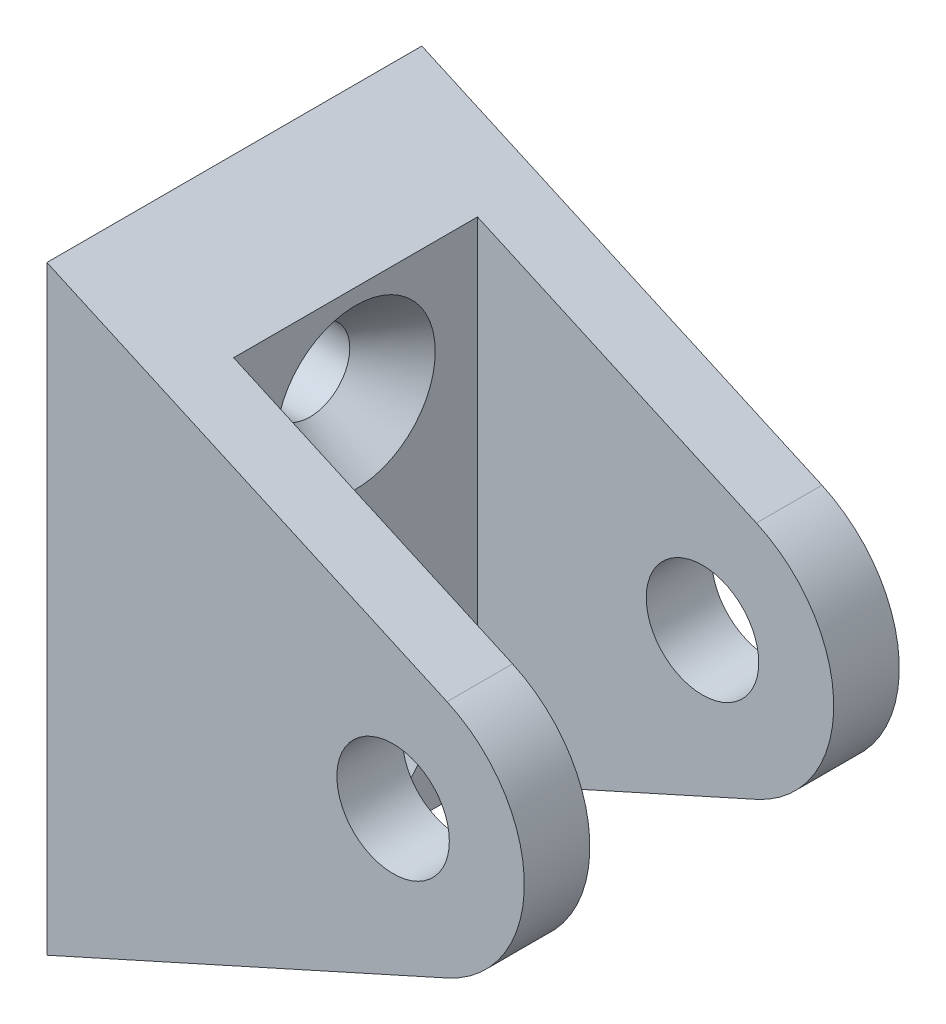
ISO-10303-21;
HEADER;
FILE_DESCRIPTION(('STEP AP214'),'2;1');
FILE_NAME('part.step','',(''),(''),'','','');
FILE_SCHEMA(('AUTOMOTIVE_DESIGN { 1 0 10303 214 1 1 1 1 }'));
ENDSEC;
DATA;
#1=APPLICATION_CONTEXT('core data for automotive mechanical design processes');
#2=APPLICATION_PROTOCOL_DEFINITION('international standard','automotive_design',2000,#1);
#3=PRODUCT_CONTEXT('',#1,'mechanical');
#4=PRODUCT('Part','Part','',(#3));
#5=PRODUCT_RELATED_PRODUCT_CATEGORY('part','',(#4));
#6=PRODUCT_DEFINITION_FORMATION('','',#4);
#7=PRODUCT_DEFINITION_CONTEXT('part definition',#1,'design');
#8=PRODUCT_DEFINITION('design','',#6,#7);
#9=PRODUCT_DEFINITION_SHAPE('','',#8);
#10=(LENGTH_UNIT() NAMED_UNIT(*) SI_UNIT(.MILLI.,.METRE.));
#11=(NAMED_UNIT(*) PLANE_ANGLE_UNIT() SI_UNIT($,.RADIAN.));
#12=(NAMED_UNIT(*) SI_UNIT($,.STERADIAN.) SOLID_ANGLE_UNIT());
#13=UNCERTAINTY_MEASURE_WITH_UNIT(LENGTH_MEASURE(1.E-05),#10,'distance_accuracy_value','');
#14=(GEOMETRIC_REPRESENTATION_CONTEXT(3) GLOBAL_UNCERTAINTY_ASSIGNED_CONTEXT((#13)) GLOBAL_UNIT_ASSIGNED_CONTEXT((#10,
#11,#12)) REPRESENTATION_CONTEXT('',''));
#15=CARTESIAN_POINT('',(0.,0.,0.));
#16=DIRECTION('',(0.,0.,1.));
#17=DIRECTION('',(1.,0.,0.));
#18=AXIS2_PLACEMENT_3D('',#15,#16,#17);
#19=CARTESIAN_POINT('',(0.,50.8,-31.75));
#20=DIRECTION('',(1.,0.,0.));
#21=DIRECTION('',(0.,0.,-1.));
#22=AXIS2_PLACEMENT_3D('',#19,#20,#21);
#23=PLANE('',#22);
#24=CARTESIAN_POINT('',(0.,38.1,-15.875));
#25=DIRECTION('',(1.,0.,0.));
#26=DIRECTION('',(0.,0.,-1.));
#27=AXIS2_PLACEMENT_3D('',#24,#25,#26);
#28=CIRCLE('',#27,3.3782);
#29=CARTESIAN_POINT('',(0.,38.1,-19.2532));
#30=VERTEX_POINT('',#29);
#31=EDGE_CURVE('E191',#30,#30,#28,.T.);
#32=ORIENTED_EDGE('',*,*,#31,.T.);
#33=EDGE_LOOP('',(#32));
#34=FACE_BOUND('',#33,.T.);
#35=CARTESIAN_POINT('',(0.,12.7,-15.875));
#36=DIRECTION('',(1.,0.,0.));
#37=DIRECTION('',(0.,0.,-1.));
#38=AXIS2_PLACEMENT_3D('',#35,#36,#37);
#39=CIRCLE('',#38,3.37819999999999);
#40=CARTESIAN_POINT('',(0.,12.7,-19.2532));
#41=VERTEX_POINT('',#40);
#42=EDGE_CURVE('E118',#41,#41,#39,.T.);
#43=ORIENTED_EDGE('',*,*,#42,.T.);
#44=EDGE_LOOP('',(#43));
#45=FACE_BOUND('',#44,.T.);
#46=DIRECTION('',(0.,0.,1.));
#47=VECTOR('',#46,1.);
#48=CARTESIAN_POINT('',(0.,0.,-31.75));
#49=LINE('',#48,#47);
#50=CARTESIAN_POINT('',(0.,0.,-31.75));
#51=VERTEX_POINT('',#50);
#52=CARTESIAN_POINT('',(0.,0.,0.));
#53=VERTEX_POINT('',#52);
#54=EDGE_CURVE('E107',#51,#53,#49,.T.);
#55=ORIENTED_EDGE('',*,*,#54,.T.);
#56=DIRECTION('',(0.,-1.,0.));
#57=VECTOR('',#56,1.);
#58=CARTESIAN_POINT('',(0.,50.8,0.));
#59=LINE('',#58,#57);
#60=CARTESIAN_POINT('',(0.,50.8,0.));
#61=VERTEX_POINT('',#60);
#62=EDGE_CURVE('E11',#61,#53,#59,.T.);
#63=ORIENTED_EDGE('',*,*,#62,.F.);
#64=DIRECTION('',(0.,0.,1.));
#65=VECTOR('',#64,1.);
#66=CARTESIAN_POINT('',(0.,50.8,-31.75));
#67=LINE('',#66,#65);
#68=CARTESIAN_POINT('',(0.,50.8,-31.75));
#69=VERTEX_POINT('',#68);
#70=EDGE_CURVE('E117',#69,#61,#67,.T.);
#71=ORIENTED_EDGE('',*,*,#70,.F.);
#72=DIRECTION('',(0.,-1.,0.));
#73=VECTOR('',#72,1.);
#74=CARTESIAN_POINT('',(0.,50.8,-31.75));
#75=LINE('',#74,#73);
#76=EDGE_CURVE('E125',#69,#51,#75,.T.);
#77=ORIENTED_EDGE('',*,*,#76,.T.);
#78=EDGE_LOOP('',(#55,#63,#71,#77));
#79=FACE_BOUND('',#78,.T.);
#80=ADVANCED_FACE('F45',(#34,#45,#79),#23,.F.);
#81=CARTESIAN_POINT('',(0.,50.8,0.));
#82=DIRECTION('',(0.,0.,-1.));
#83=DIRECTION('',(-1.,0.,0.));
#84=AXIS2_PLACEMENT_3D('',#81,#82,#83);
#85=PLANE('',#84);
#86=CARTESIAN_POINT('',(29.3156655712476,25.4,0.));
#87=DIRECTION('',(0.,0.,1.));
#88=DIRECTION('',(1.,0.,0.));
#89=AXIS2_PLACEMENT_3D('',#86,#87,#88);
#90=CIRCLE('',#89,4.7625);
#91=CARTESIAN_POINT('',(34.0781655712476,25.4,0.));
#92=VERTEX_POINT('',#91);
#93=EDGE_CURVE('E272',#92,#92,#90,.T.);
#94=ORIENTED_EDGE('',*,*,#93,.F.);
#95=EDGE_LOOP('',(#94));
#96=FACE_BOUND('',#95,.T.);
#97=ORIENTED_EDGE('',*,*,#62,.T.);
#98=DIRECTION('',(-0.91169837932912,-0.410860152763268,0.));
#99=VECTOR('',#98,1.);
#100=CARTESIAN_POINT('',(0.,0.,0.));
#101=LINE('',#100,#99);
#102=CARTESIAN_POINT('',(33.8813490188294,15.2687517597052,0.));
#103=VERTEX_POINT('',#102);
#104=EDGE_CURVE('E68',#103,#53,#101,.T.);
#105=ORIENTED_EDGE('',*,*,#104,.F.);
#106=CARTESIAN_POINT('',(29.3156655712476,25.4,0.));
#107=DIRECTION('',(0.,0.,-1.));
#108=DIRECTION('',(1.,0.,0.));
#109=AXIS2_PLACEMENT_3D('',#106,#107,#108);
#110=CIRCLE('',#109,11.1125);
#111=CARTESIAN_POINT('',(33.8813490188294,35.5312482402949,0.));
#112=VERTEX_POINT('',#111);
#113=EDGE_CURVE('E290',#112,#103,#110,.T.);
#114=ORIENTED_EDGE('',*,*,#113,.F.);
#115=DIRECTION('',(0.91169837932912,-0.410860152763267,0.));
#116=VECTOR('',#115,1.);
#117=CARTESIAN_POINT('',(0.,50.8,0.));
#118=LINE('',#117,#116);
#119=EDGE_CURVE('E278',#61,#112,#118,.T.);
#120=ORIENTED_EDGE('',*,*,#119,.F.);
#121=EDGE_LOOP('',(#97,#105,#114,#120));
#122=FACE_BOUND('',#121,.T.);
#123=ADVANCED_FACE('F231',(#96,#122),#85,.F.);
#124=CARTESIAN_POINT('',(42.0156655712476,50.8,-5.5499));
#125=DIRECTION('',(0.,0.,1.));
#126=DIRECTION('',(1.,0.,0.));
#127=AXIS2_PLACEMENT_3D('',#124,#125,#126);
#128=PLANE('',#127);
#129=CARTESIAN_POINT('',(29.3156655712476,25.4,-5.5499));
#130=DIRECTION('',(0.,0.,1.));
#131=DIRECTION('',(1.,0.,0.));
#132=AXIS2_PLACEMENT_3D('',#129,#130,#131);
#133=CIRCLE('',#132,4.7625);
#134=CARTESIAN_POINT('',(34.0781655712476,25.4,-5.5499));
#135=VERTEX_POINT('',#134);
#136=EDGE_CURVE('E173',#135,#135,#133,.T.);
#137=ORIENTED_EDGE('',*,*,#136,.T.);
#138=EDGE_LOOP('',(#137));
#139=FACE_BOUND('',#138,.T.);
#140=CARTESIAN_POINT('',(29.3156655712476,25.4,-5.5499));
#141=DIRECTION('',(0.,0.,1.));
#142=DIRECTION('',(1.,0.,0.));
#143=AXIS2_PLACEMENT_3D('',#140,#141,#142);
#144=CIRCLE('',#143,11.1125);
#145=CARTESIAN_POINT('',(33.8813490188294,35.5312482402949,-5.5499));
#146=VERTEX_POINT('',#145);
#147=CARTESIAN_POINT('',(33.8813490188294,15.2687517597052,-5.5499));
#148=VERTEX_POINT('',#147);
#149=EDGE_CURVE('E153',#146,#148,#144,.F.);
#150=ORIENTED_EDGE('',*,*,#149,.T.);
#151=DIRECTION('',(-0.91169837932912,-0.410860152763268,0.));
#152=VECTOR('',#151,1.);
#153=CARTESIAN_POINT('',(53.9518575909872,24.3135986136189,-5.5499));
#154=LINE('',#153,#152);
#155=CARTESIAN_POINT('',(10.2656655712476,4.62625910108896,-5.5499));
#156=VERTEX_POINT('',#155);
#157=EDGE_CURVE('E152',#148,#156,#154,.T.);
#158=ORIENTED_EDGE('',*,*,#157,.T.);
#159=DIRECTION('',(0.,-1.,0.));
#160=VECTOR('',#159,1.);
#161=CARTESIAN_POINT('',(10.2656655712476,50.8,-5.5499));
#162=LINE('',#161,#160);
#163=CARTESIAN_POINT('',(10.2656655712476,46.173740898911,-5.5499));
#164=VERTEX_POINT('',#163);
#165=EDGE_CURVE('E53',#164,#156,#162,.T.);
#166=ORIENTED_EDGE('',*,*,#165,.F.);
#167=DIRECTION('',(0.91169837932912,-0.410860152763267,0.));
#168=VECTOR('',#167,1.);
#169=CARTESIAN_POINT('',(34.9231663924038,35.0617494949168,-5.5499));
#170=LINE('',#169,#168);
#171=EDGE_CURVE('E151',#164,#146,#170,.T.);
#172=ORIENTED_EDGE('',*,*,#171,.T.);
#173=EDGE_LOOP('',(#150,#158,#166,#172));
#174=FACE_BOUND('',#173,.T.);
#175=ADVANCED_FACE('F150',(#139,#174),#128,.F.);
#176=CARTESIAN_POINT('',(10.2656655712476,50.8,-5.5499));
#177=DIRECTION('',(-1.,0.,0.));
#178=DIRECTION('',(0.,0.,1.));
#179=AXIS2_PLACEMENT_3D('',#176,#177,#178);
#180=PLANE('',#179);
#181=CARTESIAN_POINT('',(10.2656655712476,38.1,-15.875));
#182=DIRECTION('',(1.,0.,0.));
#183=DIRECTION('',(0.,0.,-1.));
#184=AXIS2_PLACEMENT_3D('',#181,#182,#183);
#185=CIRCLE('',#184,6.7437);
#186=CARTESIAN_POINT('',(10.2656655712476,38.1,-22.6187));
#187=VERTEX_POINT('',#186);
#188=EDGE_CURVE('E183',#187,#187,#185,.T.);
#189=ORIENTED_EDGE('',*,*,#188,.F.);
#190=EDGE_LOOP('',(#189));
#191=FACE_BOUND('',#190,.T.);
#192=CARTESIAN_POINT('',(10.2656655712476,12.7,-15.875));
#193=DIRECTION('',(1.,0.,0.));
#194=DIRECTION('',(0.,0.,-1.));
#195=AXIS2_PLACEMENT_3D('',#192,#193,#194);
#196=CIRCLE('',#195,6.7437);
#197=CARTESIAN_POINT('',(10.2656655712476,12.7,-22.6187));
#198=VERTEX_POINT('',#197);
#199=EDGE_CURVE('E195',#198,#198,#196,.T.);
#200=ORIENTED_EDGE('',*,*,#199,.F.);
#201=EDGE_LOOP('',(#200));
#202=FACE_BOUND('',#201,.T.);
#203=ORIENTED_EDGE('',*,*,#165,.T.);
#204=DIRECTION('',(0.,0.,-1.));
#205=VECTOR('',#204,1.);
#206=CARTESIAN_POINT('',(10.2656655712476,4.62625910108896,-5.5499));
#207=LINE('',#206,#205);
#208=CARTESIAN_POINT('',(10.2656655712476,4.62625910108896,-26.2001));
#209=VERTEX_POINT('',#208);
#210=EDGE_CURVE('E145',#156,#209,#207,.T.);
#211=ORIENTED_EDGE('',*,*,#210,.T.);
#212=DIRECTION('',(0.,-1.,0.));
#213=VECTOR('',#212,1.);
#214=CARTESIAN_POINT('',(10.2656655712476,50.8,-26.2001));
#215=LINE('',#214,#213);
#216=CARTESIAN_POINT('',(10.2656655712476,46.173740898911,-26.2001));
#217=VERTEX_POINT('',#216);
#218=EDGE_CURVE('E131',#217,#209,#215,.T.);
#219=ORIENTED_EDGE('',*,*,#218,.F.);
#220=DIRECTION('',(0.,0.,1.));
#221=VECTOR('',#220,1.);
#222=CARTESIAN_POINT('',(10.2656655712476,46.173740898911,-5.5499));
#223=LINE('',#222,#221);
#224=EDGE_CURVE('E60',#217,#164,#223,.T.);
#225=ORIENTED_EDGE('',*,*,#224,.T.);
#226=EDGE_LOOP('',(#203,#211,#219,#225));
#227=FACE_BOUND('',#226,.T.);
#228=ADVANCED_FACE('F143',(#191,#202,#227),#180,.F.);
#229=CARTESIAN_POINT('',(10.2656655712476,50.8,-26.2001));
#230=DIRECTION('',(0.,0.,-1.));
#231=DIRECTION('',(-1.,0.,0.));
#232=AXIS2_PLACEMENT_3D('',#229,#230,#231);
#233=PLANE('',#232);
#234=CARTESIAN_POINT('',(29.3156655712476,25.4,-26.2001));
#235=DIRECTION('',(0.,0.,-1.));
#236=DIRECTION('',(-1.,0.,0.));
#237=AXIS2_PLACEMENT_3D('',#234,#235,#236);
#238=CIRCLE('',#237,4.7625);
#239=CARTESIAN_POINT('',(24.5531655712476,25.4,-26.2001));
#240=VERTEX_POINT('',#239);
#241=EDGE_CURVE('E169',#240,#240,#238,.T.);
#242=ORIENTED_EDGE('',*,*,#241,.T.);
#243=EDGE_LOOP('',(#242));
#244=FACE_BOUND('',#243,.T.);
#245=ORIENTED_EDGE('',*,*,#218,.T.);
#246=DIRECTION('',(0.91169837932912,0.410860152763268,0.));
#247=VECTOR('',#246,1.);
#248=CARTESIAN_POINT('',(27.561450158822,12.4206666145042,-26.2001));
#249=LINE('',#248,#247);
#250=CARTESIAN_POINT('',(33.8813490188294,15.2687517597052,-26.2001));
#251=VERTEX_POINT('',#250);
#252=EDGE_CURVE('E161',#209,#251,#249,.T.);
#253=ORIENTED_EDGE('',*,*,#252,.T.);
#254=CARTESIAN_POINT('',(29.3156655712476,25.4,-26.2001));
#255=DIRECTION('',(0.,0.,-1.));
#256=DIRECTION('',(-1.,0.,0.));
#257=AXIS2_PLACEMENT_3D('',#254,#255,#256);
#258=CIRCLE('',#257,11.1125);
#259=CARTESIAN_POINT('',(33.8813490188294,35.5312482402949,-26.2001));
#260=VERTEX_POINT('',#259);
#261=EDGE_CURVE('E177',#251,#260,#258,.F.);
#262=ORIENTED_EDGE('',*,*,#261,.T.);
#263=DIRECTION('',(-0.91169837932912,0.410860152763267,0.));
#264=VECTOR('',#263,1.);
#265=CARTESIAN_POINT('',(8.53275896023857,46.9546814940315,-26.2001));
#266=LINE('',#265,#264);
#267=EDGE_CURVE('E156',#260,#217,#266,.T.);
#268=ORIENTED_EDGE('',*,*,#267,.T.);
#269=EDGE_LOOP('',(#245,#253,#262,#268));
#270=FACE_BOUND('',#269,.T.);
#271=ADVANCED_FACE('F222',(#244,#270),#233,.F.);
#272=CARTESIAN_POINT('',(42.0156655712476,50.8,-31.75));
#273=DIRECTION('',(0.,0.,1.));
#274=DIRECTION('',(1.,0.,0.));
#275=AXIS2_PLACEMENT_3D('',#272,#273,#274);
#276=PLANE('',#275);
#277=CARTESIAN_POINT('',(29.3156655712476,25.4,-31.75));
#278=DIRECTION('',(0.,0.,1.));
#279=DIRECTION('',(1.,0.,0.));
#280=AXIS2_PLACEMENT_3D('',#277,#278,#279);
#281=CIRCLE('',#280,4.7625);
#282=CARTESIAN_POINT('',(34.0781655712476,25.4,-31.75));
#283=VERTEX_POINT('',#282);
#284=EDGE_CURVE('E269',#283,#283,#281,.F.);
#285=ORIENTED_EDGE('',*,*,#284,.F.);
#286=EDGE_LOOP('',(#285));
#287=FACE_BOUND('',#286,.T.);
#288=CARTESIAN_POINT('',(29.3156655712476,25.4,-31.75));
#289=DIRECTION('',(0.,0.,1.));
#290=DIRECTION('',(1.,0.,0.));
#291=AXIS2_PLACEMENT_3D('',#288,#289,#290);
#292=CIRCLE('',#291,11.1125);
#293=CARTESIAN_POINT('',(33.8813490188294,15.2687517597052,-31.75));
#294=VERTEX_POINT('',#293);
#295=CARTESIAN_POINT('',(33.8813490188294,35.5312482402949,-31.75));
#296=VERTEX_POINT('',#295);
#297=EDGE_CURVE('E127',#294,#296,#292,.T.);
#298=ORIENTED_EDGE('',*,*,#297,.F.);
#299=DIRECTION('',(0.91169837932912,0.410860152763268,0.));
#300=VECTOR('',#299,1.);
#301=CARTESIAN_POINT('',(0.,0.,-31.75));
#302=LINE('',#301,#300);
#303=EDGE_CURVE('E111',#51,#294,#302,.T.);
#304=ORIENTED_EDGE('',*,*,#303,.F.);
#305=ORIENTED_EDGE('',*,*,#76,.F.);
#306=DIRECTION('',(-0.91169837932912,0.410860152763267,0.));
#307=VECTOR('',#306,1.);
#308=CARTESIAN_POINT('',(0.,50.8,-31.75));
#309=LINE('',#308,#307);
#310=EDGE_CURVE('E281',#296,#69,#309,.T.);
#311=ORIENTED_EDGE('',*,*,#310,.F.);
#312=EDGE_LOOP('',(#298,#304,#305,#311));
#313=FACE_BOUND('',#312,.T.);
#314=ADVANCED_FACE('F123',(#287,#313),#276,.F.);
#315=CARTESIAN_POINT('',(10.2656655712476,12.7,-15.875));
#316=DIRECTION('',(1.,0.,0.));
#317=DIRECTION('',(0.,0.,-1.));
#318=AXIS2_PLACEMENT_3D('',#315,#316,#317);
#319=CYLINDRICAL_SURFACE('',#318,3.37819999999999);
#320=ORIENTED_EDGE('',*,*,#42,.F.);
#321=EDGE_LOOP('',(#320));
#322=FACE_BOUND('',#321,.T.);
#323=CARTESIAN_POINT('',(6.39410069674526,12.7,-15.875));
#324=DIRECTION('',(1.,0.,0.));
#325=DIRECTION('',(0.,0.,-1.));
#326=AXIS2_PLACEMENT_3D('',#323,#324,#325);
#327=CIRCLE('',#326,3.37819999999999);
#328=CARTESIAN_POINT('',(6.39410069674526,12.7,-19.2532));
#329=VERTEX_POINT('',#328);
#330=EDGE_CURVE('E199',#329,#329,#327,.T.);
#331=ORIENTED_EDGE('',*,*,#330,.T.);
#332=EDGE_LOOP('',(#331));
#333=FACE_BOUND('',#332,.T.);
#334=ADVANCED_FACE('F208',(#322,#333),#319,.F.);
#335=CARTESIAN_POINT('',(10.2656655712476,12.7,-15.875));
#336=DIRECTION('',(1.,0.,0.));
#337=DIRECTION('',(0.,0.,-1.));
#338=AXIS2_PLACEMENT_3D('',#335,#336,#337);
#339=CONICAL_SURFACE('',#338,6.7437,0.715584993317674);
#340=ORIENTED_EDGE('',*,*,#330,.F.);
#341=EDGE_LOOP('',(#340));
#342=FACE_BOUND('',#341,.T.);
#343=ORIENTED_EDGE('',*,*,#199,.T.);
#344=EDGE_LOOP('',(#343));
#345=FACE_BOUND('',#344,.T.);
#346=ADVANCED_FACE('F211',(#342,#345),#339,.F.);
#347=CARTESIAN_POINT('',(10.2656655712476,38.1,-15.875));
#348=DIRECTION('',(1.,0.,0.));
#349=DIRECTION('',(0.,0.,-1.));
#350=AXIS2_PLACEMENT_3D('',#347,#348,#349);
#351=CYLINDRICAL_SURFACE('',#350,3.37819999999999);
#352=ORIENTED_EDGE('',*,*,#31,.F.);
#353=EDGE_LOOP('',(#352));
#354=FACE_BOUND('',#353,.T.);
#355=CARTESIAN_POINT('',(6.39410069674526,38.1,-15.875));
#356=DIRECTION('',(1.,0.,0.));
#357=DIRECTION('',(0.,0.,-1.));
#358=AXIS2_PLACEMENT_3D('',#355,#356,#357);
#359=CIRCLE('',#358,3.37819999999998);
#360=CARTESIAN_POINT('',(6.39410069674526,38.1,-19.2532));
#361=VERTEX_POINT('',#360);
#362=EDGE_CURVE('E187',#361,#361,#359,.T.);
#363=ORIENTED_EDGE('',*,*,#362,.T.);
#364=EDGE_LOOP('',(#363));
#365=FACE_BOUND('',#364,.T.);
#366=ADVANCED_FACE('F217',(#354,#365),#351,.F.);
#367=CARTESIAN_POINT('',(10.2656655712476,38.1,-15.875));
#368=DIRECTION('',(1.,0.,0.));
#369=DIRECTION('',(0.,0.,-1.));
#370=AXIS2_PLACEMENT_3D('',#367,#368,#369);
#371=CONICAL_SURFACE('',#370,6.7437,0.715584993317675);
#372=ORIENTED_EDGE('',*,*,#362,.F.);
#373=EDGE_LOOP('',(#372));
#374=FACE_BOUND('',#373,.T.);
#375=ORIENTED_EDGE('',*,*,#188,.T.);
#376=EDGE_LOOP('',(#375));
#377=FACE_BOUND('',#376,.T.);
#378=ADVANCED_FACE('F246',(#374,#377),#371,.F.);
#379=CARTESIAN_POINT('',(29.3156655712476,25.4,-97.6738663413708));
#380=DIRECTION('',(0.,0.,1.));
#381=DIRECTION('',(1.,0.,0.));
#382=AXIS2_PLACEMENT_3D('',#379,#380,#381);
#383=CYLINDRICAL_SURFACE('',#382,11.1125);
#384=DIRECTION('',(0.,0.,1.));
#385=VECTOR('',#384,1.);
#386=CARTESIAN_POINT('',(33.8813490188294,35.5312482402949,-97.6738663413708));
#387=LINE('',#386,#385);
#388=EDGE_CURVE('E300',#146,#112,#387,.T.);
#389=ORIENTED_EDGE('',*,*,#388,.T.);
#390=ORIENTED_EDGE('',*,*,#113,.T.);
#391=DIRECTION('',(0.,0.,1.));
#392=VECTOR('',#391,1.);
#393=CARTESIAN_POINT('',(33.8813490188294,15.2687517597052,-97.6738663413708));
#394=LINE('',#393,#392);
#395=EDGE_CURVE('E284',#148,#103,#394,.T.);
#396=ORIENTED_EDGE('',*,*,#395,.F.);
#397=ORIENTED_EDGE('',*,*,#149,.F.);
#398=EDGE_LOOP('',(#389,#390,#396,#397));
#399=FACE_BOUND('',#398,.T.);
#400=ADVANCED_FACE('F251',(#399),#383,.T.);
#401=EDGE_CURVE('E297',#294,#251,#394,.T.);
#402=ORIENTED_EDGE('',*,*,#401,.F.);
#403=ORIENTED_EDGE('',*,*,#297,.T.);
#404=EDGE_CURVE('E296',#296,#260,#387,.T.);
#405=ORIENTED_EDGE('',*,*,#404,.T.);
#406=ORIENTED_EDGE('',*,*,#261,.F.);
#407=EDGE_LOOP('',(#402,#403,#405,#406));
#408=FACE_BOUND('',#407,.T.);
#409=ADVANCED_FACE('F256',(#408),#383,.T.);
#410=CARTESIAN_POINT('',(0.,50.8,-97.6738663413708));
#411=DIRECTION('',(-0.410860152763267,-0.91169837932912,0.));
#412=DIRECTION('',(0.91169837932912,-0.410860152763267,0.));
#413=AXIS2_PLACEMENT_3D('',#410,#411,#412);
#414=PLANE('',#413);
#415=ORIENTED_EDGE('',*,*,#224,.F.);
#416=ORIENTED_EDGE('',*,*,#267,.F.);
#417=ORIENTED_EDGE('',*,*,#404,.F.);
#418=ORIENTED_EDGE('',*,*,#310,.T.);
#419=ORIENTED_EDGE('',*,*,#70,.T.);
#420=ORIENTED_EDGE('',*,*,#119,.T.);
#421=ORIENTED_EDGE('',*,*,#388,.F.);
#422=ORIENTED_EDGE('',*,*,#171,.F.);
#423=EDGE_LOOP('',(#415,#416,#417,#418,#419,#420,#421,#422));
#424=FACE_BOUND('',#423,.T.);
#425=ADVANCED_FACE('F309',(#424),#414,.F.);
#426=CARTESIAN_POINT('',(0.,0.,-97.6738663413708));
#427=DIRECTION('',(-0.410860152763268,0.91169837932912,0.));
#428=DIRECTION('',(-0.91169837932912,-0.410860152763268,0.));
#429=AXIS2_PLACEMENT_3D('',#426,#427,#428);
#430=PLANE('',#429);
#431=ORIENTED_EDGE('',*,*,#395,.T.);
#432=ORIENTED_EDGE('',*,*,#104,.T.);
#433=ORIENTED_EDGE('',*,*,#54,.F.);
#434=ORIENTED_EDGE('',*,*,#303,.T.);
#435=ORIENTED_EDGE('',*,*,#401,.T.);
#436=ORIENTED_EDGE('',*,*,#252,.F.);
#437=ORIENTED_EDGE('',*,*,#210,.F.);
#438=ORIENTED_EDGE('',*,*,#157,.F.);
#439=EDGE_LOOP('',(#431,#432,#433,#434,#435,#436,#437,#438));
#440=FACE_BOUND('',#439,.T.);
#441=ADVANCED_FACE('F109',(#440),#430,.F.);
#442=CARTESIAN_POINT('',(29.3156655712476,25.4,-97.6738663413708));
#443=DIRECTION('',(0.,0.,1.));
#444=DIRECTION('',(1.,0.,0.));
#445=AXIS2_PLACEMENT_3D('',#442,#443,#444);
#446=CYLINDRICAL_SURFACE('',#445,4.7625);
#447=ORIENTED_EDGE('',*,*,#284,.T.);
#448=EDGE_LOOP('',(#447));
#449=FACE_BOUND('',#448,.T.);
#450=ORIENTED_EDGE('',*,*,#241,.F.);
#451=EDGE_LOOP('',(#450));
#452=FACE_BOUND('',#451,.T.);
#453=ADVANCED_FACE('F318',(#449,#452),#446,.F.);
#454=ORIENTED_EDGE('',*,*,#93,.T.);
#455=EDGE_LOOP('',(#454));
#456=FACE_BOUND('',#455,.T.);
#457=ORIENTED_EDGE('',*,*,#136,.F.);
#458=EDGE_LOOP('',(#457));
#459=FACE_BOUND('',#458,.T.);
#460=ADVANCED_FACE('F260',(#456,#459),#446,.F.);
#461=CLOSED_SHELL('',(#80,#123,#175,#228,#271,#314,#334,#346,#366,#378,#400,#409,#425,#441,#453,#460));
#462=MANIFOLD_SOLID_BREP('B2',#461);
#463=ADVANCED_BREP_SHAPE_REPRESENTATION('',(#18,#462),#14);
#464=SHAPE_DEFINITION_REPRESENTATION(#9,#463);
ENDSEC;
END-ISO-10303-21;
